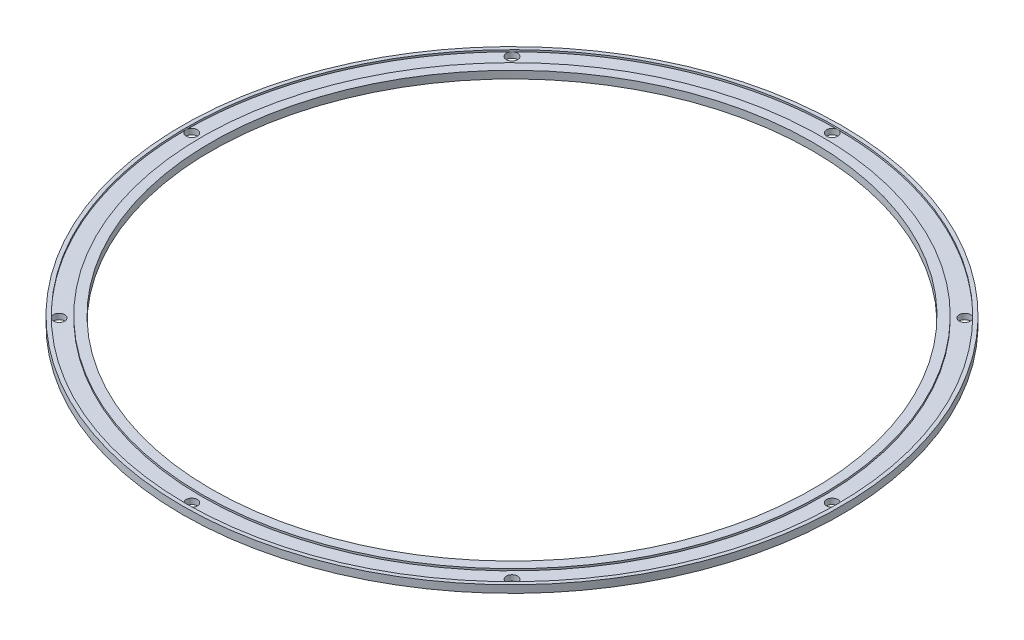
ISO-10303-21;
HEADER;
FILE_DESCRIPTION(('STEP AP214'),'2;1');
FILE_NAME('part.step','',(''),(''),'','','');
FILE_SCHEMA(('AUTOMOTIVE_DESIGN { 1 0 10303 214 1 1 1 1 }'));
ENDSEC;
DATA;
#1=APPLICATION_CONTEXT('core data for automotive mechanical design processes');
#2=APPLICATION_PROTOCOL_DEFINITION('international standard','automotive_design',2000,#1);
#3=PRODUCT_CONTEXT('',#1,'mechanical');
#4=PRODUCT('Part','Part','',(#3));
#5=PRODUCT_RELATED_PRODUCT_CATEGORY('part','',(#4));
#6=PRODUCT_DEFINITION_FORMATION('','',#4);
#7=PRODUCT_DEFINITION_CONTEXT('part definition',#1,'design');
#8=PRODUCT_DEFINITION('design','',#6,#7);
#9=PRODUCT_DEFINITION_SHAPE('','',#8);
#10=(LENGTH_UNIT() NAMED_UNIT(*) SI_UNIT(.MILLI.,.METRE.));
#11=(NAMED_UNIT(*) PLANE_ANGLE_UNIT() SI_UNIT($,.RADIAN.));
#12=(NAMED_UNIT(*) SI_UNIT($,.STERADIAN.) SOLID_ANGLE_UNIT());
#13=UNCERTAINTY_MEASURE_WITH_UNIT(LENGTH_MEASURE(1.E-05),#10,'distance_accuracy_value','');
#14=(GEOMETRIC_REPRESENTATION_CONTEXT(3) GLOBAL_UNCERTAINTY_ASSIGNED_CONTEXT((#13)) GLOBAL_UNIT_ASSIGNED_CONTEXT((#10,
#11,#12)) REPRESENTATION_CONTEXT('',''));
#15=CARTESIAN_POINT('',(0.,0.,0.));
#16=DIRECTION('',(0.,0.,1.));
#17=DIRECTION('',(1.,0.,0.));
#18=AXIS2_PLACEMENT_3D('',#15,#16,#17);
#19=CARTESIAN_POINT('',(0.,155.59735371772,0.));
#20=DIRECTION('',(0.,1.,0.));
#21=DIRECTION('',(0.,0.,1.));
#22=AXIS2_PLACEMENT_3D('',#19,#20,#21);
#23=CYLINDRICAL_SURFACE('',#22,80.25);
#24=CARTESIAN_POINT('',(0.,0.,0.));
#25=DIRECTION('',(0.,1.,0.));
#26=DIRECTION('',(0.,0.,1.));
#27=AXIS2_PLACEMENT_3D('',#24,#25,#26);
#28=CIRCLE('',#27,80.25);
#29=CARTESIAN_POINT('',(0.,0.,80.25));
#30=VERTEX_POINT('',#29);
#31=EDGE_CURVE('E11',#30,#30,#28,.T.);
#32=ORIENTED_EDGE('',*,*,#31,.F.);
#33=EDGE_LOOP('',(#32));
#34=FACE_BOUND('',#33,.T.);
#35=CARTESIAN_POINT('',(0.,2.,0.));
#36=DIRECTION('',(0.,1.,0.));
#37=DIRECTION('',(0.,0.,1.));
#38=AXIS2_PLACEMENT_3D('',#35,#36,#37);
#39=CIRCLE('',#38,80.25);
#40=CARTESIAN_POINT('',(0.,2.,80.25));
#41=VERTEX_POINT('',#40);
#42=EDGE_CURVE('E96',#41,#41,#39,.T.);
#43=ORIENTED_EDGE('',*,*,#42,.T.);
#44=EDGE_LOOP('',(#43));
#45=FACE_BOUND('',#44,.T.);
#46=ADVANCED_FACE('F34',(#34,#45),#23,.F.);
#47=CARTESIAN_POINT('',(80.25,0.,0.));
#48=DIRECTION('',(0.,1.,0.));
#49=DIRECTION('',(0.,0.,1.));
#50=AXIS2_PLACEMENT_3D('',#47,#48,#49);
#51=PLANE('',#50);
#52=CARTESIAN_POINT('',(0.,0.,-85.5));
#53=DIRECTION('',(0.,1.,0.));
#54=DIRECTION('',(0.,0.,1.));
#55=AXIS2_PLACEMENT_3D('',#52,#53,#54);
#56=CIRCLE('',#55,1.5);
#57=CARTESIAN_POINT('',(0.,0.,-84.));
#58=VERTEX_POINT('',#57);
#59=EDGE_CURVE('E100',#58,#58,#56,.T.);
#60=ORIENTED_EDGE('',*,*,#59,.T.);
#61=EDGE_LOOP('',(#60));
#62=FACE_BOUND('',#61,.T.);
#63=CARTESIAN_POINT('',(60.4576297914498,0.,-60.4576297914498));
#64=DIRECTION('',(0.,1.,0.));
#65=DIRECTION('',(0.,0.,1.));
#66=AXIS2_PLACEMENT_3D('',#63,#64,#65);
#67=CIRCLE('',#66,1.50000000000001);
#68=CARTESIAN_POINT('',(60.4576297914498,0.,-58.9576297914498));
#69=VERTEX_POINT('',#68);
#70=EDGE_CURVE('E186',#69,#69,#67,.T.);
#71=ORIENTED_EDGE('',*,*,#70,.T.);
#72=EDGE_LOOP('',(#71));
#73=FACE_BOUND('',#72,.T.);
#74=CARTESIAN_POINT('',(85.5,0.,0.));
#75=DIRECTION('',(0.,1.,0.));
#76=DIRECTION('',(0.,0.,1.));
#77=AXIS2_PLACEMENT_3D('',#74,#75,#76);
#78=CIRCLE('',#77,1.5);
#79=CARTESIAN_POINT('',(85.5,0.,1.49999999999999));
#80=VERTEX_POINT('',#79);
#81=EDGE_CURVE('E182',#80,#80,#78,.T.);
#82=ORIENTED_EDGE('',*,*,#81,.T.);
#83=EDGE_LOOP('',(#82));
#84=FACE_BOUND('',#83,.T.);
#85=CARTESIAN_POINT('',(60.4576297914498,0.,60.4576297914498));
#86=DIRECTION('',(0.,1.,0.));
#87=DIRECTION('',(0.,0.,1.));
#88=AXIS2_PLACEMENT_3D('',#85,#86,#87);
#89=CIRCLE('',#88,1.50000000000001);
#90=CARTESIAN_POINT('',(60.4576297914498,0.,61.9576297914498));
#91=VERTEX_POINT('',#90);
#92=EDGE_CURVE('E176',#91,#91,#89,.T.);
#93=ORIENTED_EDGE('',*,*,#92,.T.);
#94=EDGE_LOOP('',(#93));
#95=FACE_BOUND('',#94,.T.);
#96=CARTESIAN_POINT('',(0.,0.,85.5));
#97=DIRECTION('',(0.,1.,0.));
#98=DIRECTION('',(0.,0.,1.));
#99=AXIS2_PLACEMENT_3D('',#96,#97,#98);
#100=CIRCLE('',#99,1.5);
#101=CARTESIAN_POINT('',(0.,0.,87.));
#102=VERTEX_POINT('',#101);
#103=EDGE_CURVE('E76',#102,#102,#100,.T.);
#104=ORIENTED_EDGE('',*,*,#103,.T.);
#105=EDGE_LOOP('',(#104));
#106=FACE_BOUND('',#105,.T.);
#107=CARTESIAN_POINT('',(-60.4576297914498,0.,60.4576297914498));
#108=DIRECTION('',(0.,1.,0.));
#109=DIRECTION('',(0.,0.,1.));
#110=AXIS2_PLACEMENT_3D('',#107,#108,#109);
#111=CIRCLE('',#110,1.5);
#112=CARTESIAN_POINT('',(-60.4576297914498,0.,61.9576297914498));
#113=VERTEX_POINT('',#112);
#114=EDGE_CURVE('E77',#113,#113,#111,.T.);
#115=ORIENTED_EDGE('',*,*,#114,.T.);
#116=EDGE_LOOP('',(#115));
#117=FACE_BOUND('',#116,.T.);
#118=CARTESIAN_POINT('',(-85.5,0.,0.));
#119=DIRECTION('',(0.,1.,0.));
#120=DIRECTION('',(0.,0.,1.));
#121=AXIS2_PLACEMENT_3D('',#118,#119,#120);
#122=CIRCLE('',#121,1.5);
#123=CARTESIAN_POINT('',(-85.5,0.,1.50000000000001));
#124=VERTEX_POINT('',#123);
#125=EDGE_CURVE('E87',#124,#124,#122,.T.);
#126=ORIENTED_EDGE('',*,*,#125,.T.);
#127=EDGE_LOOP('',(#126));
#128=FACE_BOUND('',#127,.T.);
#129=CARTESIAN_POINT('',(-60.4576297914498,0.,-60.4576297914498));
#130=DIRECTION('',(0.,1.,0.));
#131=DIRECTION('',(0.,0.,1.));
#132=AXIS2_PLACEMENT_3D('',#129,#130,#131);
#133=CIRCLE('',#132,1.50000000000001);
#134=CARTESIAN_POINT('',(-60.4576297914498,0.,-58.9576297914498));
#135=VERTEX_POINT('',#134);
#136=EDGE_CURVE('E91',#135,#135,#133,.T.);
#137=ORIENTED_EDGE('',*,*,#136,.T.);
#138=EDGE_LOOP('',(#137));
#139=FACE_BOUND('',#138,.T.);
#140=CARTESIAN_POINT('',(0.,0.,0.));
#141=DIRECTION('',(0.,1.,0.));
#142=DIRECTION('',(0.,0.,1.));
#143=AXIS2_PLACEMENT_3D('',#140,#141,#142);
#144=CIRCLE('',#143,88.);
#145=CARTESIAN_POINT('',(0.,0.,88.));
#146=VERTEX_POINT('',#145);
#147=EDGE_CURVE('E41',#146,#146,#144,.T.);
#148=ORIENTED_EDGE('',*,*,#147,.F.);
#149=EDGE_LOOP('',(#148));
#150=FACE_BOUND('',#149,.T.);
#151=ORIENTED_EDGE('',*,*,#31,.T.);
#152=EDGE_LOOP('',(#151));
#153=FACE_BOUND('',#152,.T.);
#154=ADVANCED_FACE('F120',(#62,#73,#84,#95,#106,#117,#128,#139,#150,#153),#51,.F.);
#155=CARTESIAN_POINT('',(0.,155.59735371772,0.));
#156=DIRECTION('',(0.,1.,0.));
#157=DIRECTION('',(0.,0.,1.));
#158=AXIS2_PLACEMENT_3D('',#155,#156,#157);
#159=CYLINDRICAL_SURFACE('',#158,88.);
#160=CARTESIAN_POINT('',(0.,2.,0.));
#161=DIRECTION('',(0.,1.,0.));
#162=DIRECTION('',(0.,0.,1.));
#163=AXIS2_PLACEMENT_3D('',#160,#161,#162);
#164=CIRCLE('',#163,88.);
#165=CARTESIAN_POINT('',(0.,2.,88.));
#166=VERTEX_POINT('',#165);
#167=EDGE_CURVE('E113',#166,#166,#164,.T.);
#168=ORIENTED_EDGE('',*,*,#167,.F.);
#169=EDGE_LOOP('',(#168));
#170=FACE_BOUND('',#169,.T.);
#171=ORIENTED_EDGE('',*,*,#147,.T.);
#172=EDGE_LOOP('',(#171));
#173=FACE_BOUND('',#172,.T.);
#174=ADVANCED_FACE('F118',(#170,#173),#159,.T.);
#175=CARTESIAN_POINT('',(87.,2.,0.));
#176=DIRECTION('',(0.,-1.,0.));
#177=DIRECTION('',(0.,0.,-1.));
#178=AXIS2_PLACEMENT_3D('',#175,#176,#177);
#179=PLANE('',#178);
#180=CARTESIAN_POINT('',(0.,2.,0.));
#181=DIRECTION('',(0.,1.,0.));
#182=DIRECTION('',(0.,0.,1.));
#183=AXIS2_PLACEMENT_3D('',#180,#181,#182);
#184=CIRCLE('',#183,87.);
#185=CARTESIAN_POINT('',(0.,2.,87.));
#186=VERTEX_POINT('',#185);
#187=EDGE_CURVE('E109',#186,#186,#184,.T.);
#188=ORIENTED_EDGE('',*,*,#187,.F.);
#189=EDGE_LOOP('',(#188));
#190=FACE_BOUND('',#189,.T.);
#191=ORIENTED_EDGE('',*,*,#167,.T.);
#192=EDGE_LOOP('',(#191));
#193=FACE_BOUND('',#192,.T.);
#194=ADVANCED_FACE('F229',(#190,#193),#179,.F.);
#195=CARTESIAN_POINT('',(0.,155.59735371772,0.));
#196=DIRECTION('',(0.,1.,0.));
#197=DIRECTION('',(0.,0.,1.));
#198=AXIS2_PLACEMENT_3D('',#195,#196,#197);
#199=CYLINDRICAL_SURFACE('',#198,87.);
#200=CARTESIAN_POINT('',(0.,1.5,0.));
#201=DIRECTION('',(0.,1.,0.));
#202=DIRECTION('',(0.,0.,1.));
#203=AXIS2_PLACEMENT_3D('',#200,#201,#202);
#204=CIRCLE('',#203,87.);
#205=CARTESIAN_POINT('',(0.,1.5,87.));
#206=VERTEX_POINT('',#205);
#207=CARTESIAN_POINT('',(61.5182899632296,1.5,61.5182899632296));
#208=VERTEX_POINT('',#207);
#209=EDGE_CURVE('E107',#206,#208,#204,.T.);
#210=ORIENTED_EDGE('',*,*,#209,.F.);
#211=CARTESIAN_POINT('',(-61.5182899632296,1.5,61.5182899632297));
#212=VERTEX_POINT('',#211);
#213=EDGE_CURVE('E106',#212,#206,#204,.T.);
#214=ORIENTED_EDGE('',*,*,#213,.F.);
#215=CARTESIAN_POINT('',(-87.,1.5,0.));
#216=VERTEX_POINT('',#215);
#217=EDGE_CURVE('E164',#216,#212,#204,.T.);
#218=ORIENTED_EDGE('',*,*,#217,.F.);
#219=CARTESIAN_POINT('',(-61.5182899632297,1.5,-61.5182899632296));
#220=VERTEX_POINT('',#219);
#221=EDGE_CURVE('E161',#220,#216,#204,.T.);
#222=ORIENTED_EDGE('',*,*,#221,.F.);
#223=CARTESIAN_POINT('',(0.,1.5,-87.));
#224=VERTEX_POINT('',#223);
#225=EDGE_CURVE('E160',#224,#220,#204,.T.);
#226=ORIENTED_EDGE('',*,*,#225,.F.);
#227=CARTESIAN_POINT('',(61.5182899632296,1.5,-61.5182899632296));
#228=VERTEX_POINT('',#227);
#229=EDGE_CURVE('E151',#228,#224,#204,.T.);
#230=ORIENTED_EDGE('',*,*,#229,.F.);
#231=CARTESIAN_POINT('',(87.,1.5,0.));
#232=VERTEX_POINT('',#231);
#233=EDGE_CURVE('E159',#232,#228,#204,.T.);
#234=ORIENTED_EDGE('',*,*,#233,.F.);
#235=EDGE_CURVE('E110',#208,#232,#204,.T.);
#236=ORIENTED_EDGE('',*,*,#235,.F.);
#237=EDGE_LOOP('',(#210,#214,#218,#222,#226,#230,#234,#236));
#238=FACE_BOUND('',#237,.T.);
#239=ORIENTED_EDGE('',*,*,#187,.T.);
#240=EDGE_LOOP('',(#239));
#241=FACE_BOUND('',#240,.T.);
#242=ADVANCED_FACE('F145',(#238,#241),#199,.F.);
#243=CARTESIAN_POINT('',(82.75,1.5,0.));
#244=DIRECTION('',(0.,-1.,0.));
#245=DIRECTION('',(0.,0.,-1.));
#246=AXIS2_PLACEMENT_3D('',#243,#244,#245);
#247=PLANE('',#246);
#248=CARTESIAN_POINT('',(0.,1.5,0.));
#249=DIRECTION('',(0.,1.,0.));
#250=DIRECTION('',(0.,0.,1.));
#251=AXIS2_PLACEMENT_3D('',#248,#249,#250);
#252=CIRCLE('',#251,82.75);
#253=CARTESIAN_POINT('',(0.,1.5,82.75));
#254=VERTEX_POINT('',#253);
#255=EDGE_CURVE('E103',#254,#254,#252,.T.);
#256=ORIENTED_EDGE('',*,*,#255,.F.);
#257=EDGE_LOOP('',(#256));
#258=FACE_BOUND('',#257,.T.);
#259=ORIENTED_EDGE('',*,*,#229,.T.);
#260=CARTESIAN_POINT('',(0.,1.5,-85.5));
#261=DIRECTION('',(0.,1.,0.));
#262=DIRECTION('',(0.,0.,1.));
#263=AXIS2_PLACEMENT_3D('',#260,#261,#262);
#264=CIRCLE('',#263,1.5);
#265=EDGE_CURVE('E153',#224,#224,#264,.T.);
#266=ORIENTED_EDGE('',*,*,#265,.F.);
#267=ORIENTED_EDGE('',*,*,#225,.T.);
#268=CARTESIAN_POINT('',(-60.4576297914498,1.5,-60.4576297914498));
#269=DIRECTION('',(0.,1.,0.));
#270=DIRECTION('',(0.,0.,1.));
#271=AXIS2_PLACEMENT_3D('',#268,#269,#270);
#272=CIRCLE('',#271,1.50000000000001);
#273=EDGE_CURVE('E94',#220,#220,#272,.T.);
#274=ORIENTED_EDGE('',*,*,#273,.F.);
#275=ORIENTED_EDGE('',*,*,#221,.T.);
#276=CARTESIAN_POINT('',(-85.5,1.5,0.));
#277=DIRECTION('',(0.,1.,0.));
#278=DIRECTION('',(0.,0.,1.));
#279=AXIS2_PLACEMENT_3D('',#276,#277,#278);
#280=CIRCLE('',#279,1.5);
#281=EDGE_CURVE('E51',#216,#216,#280,.T.);
#282=ORIENTED_EDGE('',*,*,#281,.F.);
#283=ORIENTED_EDGE('',*,*,#217,.T.);
#284=CARTESIAN_POINT('',(-60.4576297914498,1.5,60.4576297914498));
#285=DIRECTION('',(0.,1.,0.));
#286=DIRECTION('',(0.,0.,1.));
#287=AXIS2_PLACEMENT_3D('',#284,#285,#286);
#288=CIRCLE('',#287,1.5);
#289=EDGE_CURVE('E46',#212,#212,#288,.T.);
#290=ORIENTED_EDGE('',*,*,#289,.F.);
#291=ORIENTED_EDGE('',*,*,#213,.T.);
#292=CARTESIAN_POINT('',(0.,1.5,85.5));
#293=DIRECTION('',(0.,1.,0.));
#294=DIRECTION('',(0.,0.,1.));
#295=AXIS2_PLACEMENT_3D('',#292,#293,#294);
#296=CIRCLE('',#295,1.5);
#297=EDGE_CURVE('E71',#206,#206,#296,.T.);
#298=ORIENTED_EDGE('',*,*,#297,.F.);
#299=ORIENTED_EDGE('',*,*,#209,.T.);
#300=CARTESIAN_POINT('',(60.4576297914498,1.5,60.4576297914498));
#301=DIRECTION('',(0.,1.,0.));
#302=DIRECTION('',(0.,0.,1.));
#303=AXIS2_PLACEMENT_3D('',#300,#301,#302);
#304=CIRCLE('',#303,1.50000000000001);
#305=EDGE_CURVE('E80',#208,#208,#304,.T.);
#306=ORIENTED_EDGE('',*,*,#305,.F.);
#307=ORIENTED_EDGE('',*,*,#235,.T.);
#308=CARTESIAN_POINT('',(85.5,1.5,0.));
#309=DIRECTION('',(0.,1.,0.));
#310=DIRECTION('',(0.,0.,1.));
#311=AXIS2_PLACEMENT_3D('',#308,#309,#310);
#312=CIRCLE('',#311,1.5);
#313=EDGE_CURVE('E178',#232,#232,#312,.T.);
#314=ORIENTED_EDGE('',*,*,#313,.F.);
#315=ORIENTED_EDGE('',*,*,#233,.T.);
#316=CARTESIAN_POINT('',(60.4576297914498,1.5,-60.4576297914498));
#317=DIRECTION('',(0.,1.,0.));
#318=DIRECTION('',(0.,0.,1.));
#319=AXIS2_PLACEMENT_3D('',#316,#317,#318);
#320=CIRCLE('',#319,1.50000000000001);
#321=EDGE_CURVE('E156',#228,#228,#320,.T.);
#322=ORIENTED_EDGE('',*,*,#321,.F.);
#323=EDGE_LOOP('',(#259,#266,#267,#274,#275,#282,#283,#290,#291,#298,#299,#306,#307,#314,#315,#322));
#324=FACE_BOUND('',#323,.T.);
#325=ADVANCED_FACE('F140',(#258,#324),#247,.F.);
#326=CARTESIAN_POINT('',(0.,155.59735371772,0.));
#327=DIRECTION('',(0.,1.,0.));
#328=DIRECTION('',(0.,0.,1.));
#329=AXIS2_PLACEMENT_3D('',#326,#327,#328);
#330=CYLINDRICAL_SURFACE('',#329,82.75);
#331=CARTESIAN_POINT('',(0.,2.,0.));
#332=DIRECTION('',(0.,1.,0.));
#333=DIRECTION('',(0.,0.,1.));
#334=AXIS2_PLACEMENT_3D('',#331,#332,#333);
#335=CIRCLE('',#334,82.75);
#336=CARTESIAN_POINT('',(0.,2.,82.75));
#337=VERTEX_POINT('',#336);
#338=EDGE_CURVE('E99',#337,#337,#335,.T.);
#339=ORIENTED_EDGE('',*,*,#338,.F.);
#340=EDGE_LOOP('',(#339));
#341=FACE_BOUND('',#340,.T.);
#342=ORIENTED_EDGE('',*,*,#255,.T.);
#343=EDGE_LOOP('',(#342));
#344=FACE_BOUND('',#343,.T.);
#345=ADVANCED_FACE('F134',(#341,#344),#330,.T.);
#346=CARTESIAN_POINT('',(82.75,2.,0.));
#347=DIRECTION('',(0.,-1.,0.));
#348=DIRECTION('',(0.,0.,-1.));
#349=AXIS2_PLACEMENT_3D('',#346,#347,#348);
#350=PLANE('',#349);
#351=ORIENTED_EDGE('',*,*,#42,.F.);
#352=EDGE_LOOP('',(#351));
#353=FACE_BOUND('',#352,.T.);
#354=ORIENTED_EDGE('',*,*,#338,.T.);
#355=EDGE_LOOP('',(#354));
#356=FACE_BOUND('',#355,.T.);
#357=ADVANCED_FACE('F130',(#353,#356),#350,.F.);
#358=CARTESIAN_POINT('',(-60.4576297914498,0.,-60.4576297914498));
#359=DIRECTION('',(0.,1.,0.));
#360=DIRECTION('',(0.,0.,1.));
#361=AXIS2_PLACEMENT_3D('',#358,#359,#360);
#362=CYLINDRICAL_SURFACE('',#361,1.50000000000001);
#363=ORIENTED_EDGE('',*,*,#136,.F.);
#364=EDGE_LOOP('',(#363));
#365=FACE_BOUND('',#364,.T.);
#366=ORIENTED_EDGE('',*,*,#273,.T.);
#367=EDGE_LOOP('',(#366));
#368=FACE_BOUND('',#367,.T.);
#369=ADVANCED_FACE('F133',(#365,#368),#362,.F.);
#370=CARTESIAN_POINT('',(-85.5,0.,0.));
#371=DIRECTION('',(0.,1.,0.));
#372=DIRECTION('',(0.,0.,1.));
#373=AXIS2_PLACEMENT_3D('',#370,#371,#372);
#374=CYLINDRICAL_SURFACE('',#373,1.5);
#375=ORIENTED_EDGE('',*,*,#125,.F.);
#376=EDGE_LOOP('',(#375));
#377=FACE_BOUND('',#376,.T.);
#378=ORIENTED_EDGE('',*,*,#281,.T.);
#379=EDGE_LOOP('',(#378));
#380=FACE_BOUND('',#379,.T.);
#381=ADVANCED_FACE('F219',(#377,#380),#374,.F.);
#382=CARTESIAN_POINT('',(-60.4576297914498,0.,60.4576297914498));
#383=DIRECTION('',(0.,1.,0.));
#384=DIRECTION('',(0.,0.,1.));
#385=AXIS2_PLACEMENT_3D('',#382,#383,#384);
#386=CYLINDRICAL_SURFACE('',#385,1.5);
#387=ORIENTED_EDGE('',*,*,#114,.F.);
#388=EDGE_LOOP('',(#387));
#389=FACE_BOUND('',#388,.T.);
#390=ORIENTED_EDGE('',*,*,#289,.T.);
#391=EDGE_LOOP('',(#390));
#392=FACE_BOUND('',#391,.T.);
#393=ADVANCED_FACE('F215',(#389,#392),#386,.F.);
#394=CARTESIAN_POINT('',(0.,0.,85.5));
#395=DIRECTION('',(0.,1.,0.));
#396=DIRECTION('',(0.,0.,1.));
#397=AXIS2_PLACEMENT_3D('',#394,#395,#396);
#398=CYLINDRICAL_SURFACE('',#397,1.5);
#399=ORIENTED_EDGE('',*,*,#103,.F.);
#400=EDGE_LOOP('',(#399));
#401=FACE_BOUND('',#400,.T.);
#402=ORIENTED_EDGE('',*,*,#297,.T.);
#403=EDGE_LOOP('',(#402));
#404=FACE_BOUND('',#403,.T.);
#405=ADVANCED_FACE('F72',(#401,#404),#398,.F.);
#406=CARTESIAN_POINT('',(60.4576297914498,0.,60.4576297914498));
#407=DIRECTION('',(0.,1.,0.));
#408=DIRECTION('',(0.,0.,1.));
#409=AXIS2_PLACEMENT_3D('',#406,#407,#408);
#410=CYLINDRICAL_SURFACE('',#409,1.50000000000001);
#411=ORIENTED_EDGE('',*,*,#92,.F.);
#412=EDGE_LOOP('',(#411));
#413=FACE_BOUND('',#412,.T.);
#414=ORIENTED_EDGE('',*,*,#305,.T.);
#415=EDGE_LOOP('',(#414));
#416=FACE_BOUND('',#415,.T.);
#417=ADVANCED_FACE('F208',(#413,#416),#410,.F.);
#418=CARTESIAN_POINT('',(85.5,0.,0.));
#419=DIRECTION('',(0.,1.,0.));
#420=DIRECTION('',(0.,0.,1.));
#421=AXIS2_PLACEMENT_3D('',#418,#419,#420);
#422=CYLINDRICAL_SURFACE('',#421,1.5);
#423=ORIENTED_EDGE('',*,*,#81,.F.);
#424=EDGE_LOOP('',(#423));
#425=FACE_BOUND('',#424,.T.);
#426=ORIENTED_EDGE('',*,*,#313,.T.);
#427=EDGE_LOOP('',(#426));
#428=FACE_BOUND('',#427,.T.);
#429=ADVANCED_FACE('F202',(#425,#428),#422,.F.);
#430=CARTESIAN_POINT('',(60.4576297914498,0.,-60.4576297914498));
#431=DIRECTION('',(0.,1.,0.));
#432=DIRECTION('',(0.,0.,1.));
#433=AXIS2_PLACEMENT_3D('',#430,#431,#432);
#434=CYLINDRICAL_SURFACE('',#433,1.50000000000001);
#435=ORIENTED_EDGE('',*,*,#70,.F.);
#436=EDGE_LOOP('',(#435));
#437=FACE_BOUND('',#436,.T.);
#438=ORIENTED_EDGE('',*,*,#321,.T.);
#439=EDGE_LOOP('',(#438));
#440=FACE_BOUND('',#439,.T.);
#441=ADVANCED_FACE('F197',(#437,#440),#434,.F.);
#442=CARTESIAN_POINT('',(0.,0.,-85.5));
#443=DIRECTION('',(0.,1.,0.));
#444=DIRECTION('',(0.,0.,1.));
#445=AXIS2_PLACEMENT_3D('',#442,#443,#444);
#446=CYLINDRICAL_SURFACE('',#445,1.5);
#447=ORIENTED_EDGE('',*,*,#59,.F.);
#448=EDGE_LOOP('',(#447));
#449=FACE_BOUND('',#448,.T.);
#450=ORIENTED_EDGE('',*,*,#265,.T.);
#451=EDGE_LOOP('',(#450));
#452=FACE_BOUND('',#451,.T.);
#453=ADVANCED_FACE('F194',(#449,#452),#446,.F.);
#454=CLOSED_SHELL('',(#46,#154,#174,#194,#242,#325,#345,#357,#369,#381,#393,#405,#417,#429,#441,#453));
#455=MANIFOLD_SOLID_BREP('B2',#454);
#456=ADVANCED_BREP_SHAPE_REPRESENTATION('',(#18,#455),#14);
#457=SHAPE_DEFINITION_REPRESENTATION(#9,#456);
ENDSEC;
END-ISO-10303-21;
